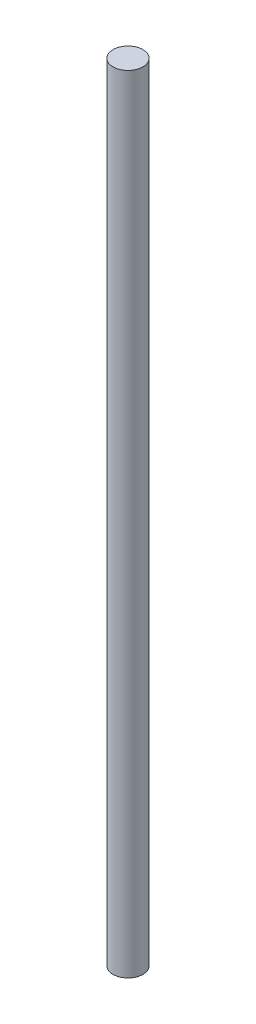
ISO-10303-21;
HEADER;
FILE_DESCRIPTION(('STEP AP214'),'2;1');
FILE_NAME('part.step','',(''),(''),'','','');
FILE_SCHEMA(('AUTOMOTIVE_DESIGN { 1 0 10303 214 1 1 1 1 }'));
ENDSEC;
DATA;
#1=APPLICATION_CONTEXT('core data for automotive mechanical design processes');
#2=APPLICATION_PROTOCOL_DEFINITION('international standard','automotive_design',2000,#1);
#3=PRODUCT_CONTEXT('',#1,'mechanical');
#4=PRODUCT('Part','Part','',(#3));
#5=PRODUCT_RELATED_PRODUCT_CATEGORY('part','',(#4));
#6=PRODUCT_DEFINITION_FORMATION('','',#4);
#7=PRODUCT_DEFINITION_CONTEXT('part definition',#1,'design');
#8=PRODUCT_DEFINITION('design','',#6,#7);
#9=PRODUCT_DEFINITION_SHAPE('','',#8);
#10=(LENGTH_UNIT() NAMED_UNIT(*) SI_UNIT(.MILLI.,.METRE.));
#11=(NAMED_UNIT(*) PLANE_ANGLE_UNIT() SI_UNIT($,.RADIAN.));
#12=(NAMED_UNIT(*) SI_UNIT($,.STERADIAN.) SOLID_ANGLE_UNIT());
#13=UNCERTAINTY_MEASURE_WITH_UNIT(LENGTH_MEASURE(1.E-05),#10,'distance_accuracy_value','');
#14=(GEOMETRIC_REPRESENTATION_CONTEXT(3) GLOBAL_UNCERTAINTY_ASSIGNED_CONTEXT((#13)) GLOBAL_UNIT_ASSIGNED_CONTEXT((#10,
#11,#12)) REPRESENTATION_CONTEXT('',''));
#15=CARTESIAN_POINT('',(0.,0.,0.));
#16=DIRECTION('',(0.,0.,1.));
#17=DIRECTION('',(1.,0.,0.));
#18=AXIS2_PLACEMENT_3D('',#15,#16,#17);
#19=CARTESIAN_POINT('',(0.,210.,0.));
#20=DIRECTION('',(0.,-1.,0.));
#21=DIRECTION('',(0.,0.,-1.));
#22=AXIS2_PLACEMENT_3D('',#19,#20,#21);
#23=CYLINDRICAL_SURFACE('',#22,4.);
#24=CARTESIAN_POINT('',(0.,210.,0.));
#25=DIRECTION('',(0.,1.,0.));
#26=DIRECTION('',(0.,0.,1.));
#27=AXIS2_PLACEMENT_3D('',#24,#25,#26);
#28=CIRCLE('',#27,4.);
#29=CARTESIAN_POINT('',(0.,210.,4.));
#30=VERTEX_POINT('',#29);
#31=EDGE_CURVE('E10',#30,#30,#28,.T.);
#32=ORIENTED_EDGE('',*,*,#31,.F.);
#33=EDGE_LOOP('',(#32));
#34=FACE_BOUND('',#33,.T.);
#35=CARTESIAN_POINT('',(0.,0.,0.));
#36=DIRECTION('',(0.,1.,0.));
#37=DIRECTION('',(0.,0.,1.));
#38=AXIS2_PLACEMENT_3D('',#35,#36,#37);
#39=CIRCLE('',#38,4.);
#40=CARTESIAN_POINT('',(0.,0.,4.));
#41=VERTEX_POINT('',#40);
#42=EDGE_CURVE('E40',#41,#41,#39,.T.);
#43=ORIENTED_EDGE('',*,*,#42,.T.);
#44=EDGE_LOOP('',(#43));
#45=FACE_BOUND('',#44,.T.);
#46=ADVANCED_FACE('F37',(#34,#45),#23,.T.);
#47=CARTESIAN_POINT('',(0.,210.,0.));
#48=DIRECTION('',(0.,1.,0.));
#49=DIRECTION('',(0.,0.,1.));
#50=AXIS2_PLACEMENT_3D('',#47,#48,#49);
#51=PLANE('',#50);
#52=ORIENTED_EDGE('',*,*,#31,.T.);
#53=EDGE_LOOP('',(#52));
#54=FACE_BOUND('',#53,.T.);
#55=ADVANCED_FACE('F54',(#54),#51,.T.);
#56=CARTESIAN_POINT('',(0.,0.,0.));
#57=DIRECTION('',(0.,1.,0.));
#58=DIRECTION('',(0.,0.,1.));
#59=AXIS2_PLACEMENT_3D('',#56,#57,#58);
#60=PLANE('',#59);
#61=ORIENTED_EDGE('',*,*,#42,.F.);
#62=EDGE_LOOP('',(#61));
#63=FACE_BOUND('',#62,.T.);
#64=ADVANCED_FACE('F52',(#63),#60,.F.);
#65=CLOSED_SHELL('',(#46,#55,#64));
#66=MANIFOLD_SOLID_BREP('B2',#65);
#67=ADVANCED_BREP_SHAPE_REPRESENTATION('',(#18,#66),#14);
#68=SHAPE_DEFINITION_REPRESENTATION(#9,#67);
ENDSEC;
END-ISO-10303-21;
